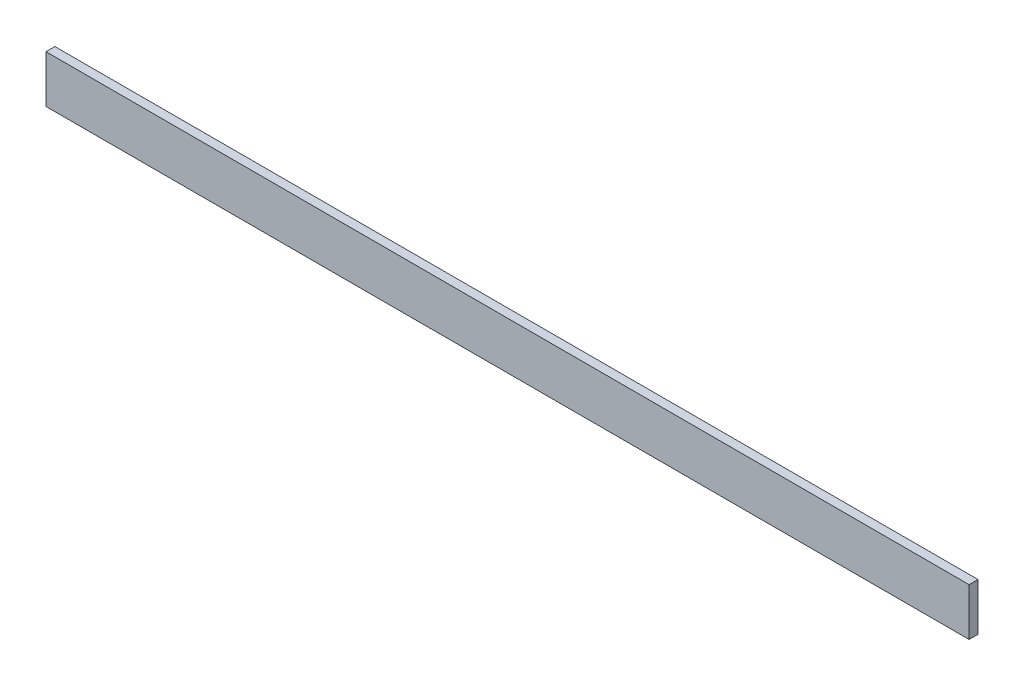
ISO-10303-21;
HEADER;
FILE_DESCRIPTION(('STEP AP214'),'2;1');
FILE_NAME('part.step','',(''),(''),'','','');
FILE_SCHEMA(('AUTOMOTIVE_DESIGN { 1 0 10303 214 1 1 1 1 }'));
ENDSEC;
DATA;
#1=APPLICATION_CONTEXT('core data for automotive mechanical design processes');
#2=APPLICATION_PROTOCOL_DEFINITION('international standard','automotive_design',2000,#1);
#3=PRODUCT_CONTEXT('',#1,'mechanical');
#4=PRODUCT('Part','Part','',(#3));
#5=PRODUCT_RELATED_PRODUCT_CATEGORY('part','',(#4));
#6=PRODUCT_DEFINITION_FORMATION('','',#4);
#7=PRODUCT_DEFINITION_CONTEXT('part definition',#1,'design');
#8=PRODUCT_DEFINITION('design','',#6,#7);
#9=PRODUCT_DEFINITION_SHAPE('','',#8);
#10=(LENGTH_UNIT() NAMED_UNIT(*) SI_UNIT(.MILLI.,.METRE.));
#11=(NAMED_UNIT(*) PLANE_ANGLE_UNIT() SI_UNIT($,.RADIAN.));
#12=(NAMED_UNIT(*) SI_UNIT($,.STERADIAN.) SOLID_ANGLE_UNIT());
#13=UNCERTAINTY_MEASURE_WITH_UNIT(LENGTH_MEASURE(1.E-05),#10,'distance_accuracy_value','');
#14=(GEOMETRIC_REPRESENTATION_CONTEXT(3) GLOBAL_UNCERTAINTY_ASSIGNED_CONTEXT((#13)) GLOBAL_UNIT_ASSIGNED_CONTEXT((#10,
#11,#12)) REPRESENTATION_CONTEXT('',''));
#15=CARTESIAN_POINT('',(0.,0.,0.));
#16=DIRECTION('',(0.,0.,1.));
#17=DIRECTION('',(1.,0.,0.));
#18=AXIS2_PLACEMENT_3D('',#15,#16,#17);
#19=CARTESIAN_POINT('',(0.,0.,9.525));
#20=DIRECTION('',(1.,0.,0.));
#21=DIRECTION('',(0.,0.,-1.));
#22=AXIS2_PLACEMENT_3D('',#19,#20,#21);
#23=PLANE('',#22);
#24=DIRECTION('',(0.,-1.,0.));
#25=VECTOR('',#24,1.);
#26=CARTESIAN_POINT('',(0.,0.,0.));
#27=LINE('',#26,#25);
#28=CARTESIAN_POINT('',(0.,50.8,0.));
#29=VERTEX_POINT('',#28);
#30=CARTESIAN_POINT('',(0.,0.,0.));
#31=VERTEX_POINT('',#30);
#32=EDGE_CURVE('E100',#29,#31,#27,.T.);
#33=ORIENTED_EDGE('',*,*,#32,.T.);
#34=DIRECTION('',(0.,0.,-1.));
#35=VECTOR('',#34,1.);
#36=CARTESIAN_POINT('',(0.,0.,9.525));
#37=LINE('',#36,#35);
#38=CARTESIAN_POINT('',(0.,0.,9.525));
#39=VERTEX_POINT('',#38);
#40=EDGE_CURVE('E11',#39,#31,#37,.T.);
#41=ORIENTED_EDGE('',*,*,#40,.F.);
#42=DIRECTION('',(0.,-1.,0.));
#43=VECTOR('',#42,1.);
#44=CARTESIAN_POINT('',(0.,0.,9.525));
#45=LINE('',#44,#43);
#46=CARTESIAN_POINT('',(0.,50.8,9.525));
#47=VERTEX_POINT('',#46);
#48=EDGE_CURVE('E88',#47,#39,#45,.T.);
#49=ORIENTED_EDGE('',*,*,#48,.F.);
#50=DIRECTION('',(0.,0.,-1.));
#51=VECTOR('',#50,1.);
#52=CARTESIAN_POINT('',(0.,50.8,9.525));
#53=LINE('',#52,#51);
#54=EDGE_CURVE('E96',#47,#29,#53,.T.);
#55=ORIENTED_EDGE('',*,*,#54,.T.);
#56=EDGE_LOOP('',(#33,#41,#49,#55));
#57=FACE_BOUND('',#56,.T.);
#58=ADVANCED_FACE('F37',(#57),#23,.F.);
#59=CARTESIAN_POINT('',(0.,0.,9.525));
#60=DIRECTION('',(0.,1.,0.));
#61=DIRECTION('',(0.,0.,1.));
#62=AXIS2_PLACEMENT_3D('',#59,#60,#61);
#63=PLANE('',#62);
#64=DIRECTION('',(1.,0.,0.));
#65=VECTOR('',#64,1.);
#66=CARTESIAN_POINT('',(0.,0.,0.));
#67=LINE('',#66,#65);
#68=CARTESIAN_POINT('',(987.6,0.,0.));
#69=VERTEX_POINT('',#68);
#70=EDGE_CURVE('E92',#31,#69,#67,.T.);
#71=ORIENTED_EDGE('',*,*,#70,.T.);
#72=DIRECTION('',(0.,0.,-1.));
#73=VECTOR('',#72,1.);
#74=CARTESIAN_POINT('',(987.6,0.,9.525));
#75=LINE('',#74,#73);
#76=CARTESIAN_POINT('',(987.6,0.,9.525));
#77=VERTEX_POINT('',#76);
#78=EDGE_CURVE('E45',#77,#69,#75,.T.);
#79=ORIENTED_EDGE('',*,*,#78,.F.);
#80=DIRECTION('',(1.,0.,0.));
#81=VECTOR('',#80,1.);
#82=CARTESIAN_POINT('',(0.,0.,9.525));
#83=LINE('',#82,#81);
#84=EDGE_CURVE('E83',#39,#77,#83,.T.);
#85=ORIENTED_EDGE('',*,*,#84,.F.);
#86=ORIENTED_EDGE('',*,*,#40,.T.);
#87=EDGE_LOOP('',(#71,#79,#85,#86));
#88=FACE_BOUND('',#87,.T.);
#89=ADVANCED_FACE('F91',(#88),#63,.F.);
#90=CARTESIAN_POINT('',(987.6,0.,9.525));
#91=DIRECTION('',(-1.,0.,0.));
#92=DIRECTION('',(0.,0.,1.));
#93=AXIS2_PLACEMENT_3D('',#90,#91,#92);
#94=PLANE('',#93);
#95=DIRECTION('',(0.,1.,0.));
#96=VECTOR('',#95,1.);
#97=CARTESIAN_POINT('',(987.6,0.,0.));
#98=LINE('',#97,#96);
#99=CARTESIAN_POINT('',(987.6,50.8,0.));
#100=VERTEX_POINT('',#99);
#101=EDGE_CURVE('E70',#69,#100,#98,.T.);
#102=ORIENTED_EDGE('',*,*,#101,.T.);
#103=DIRECTION('',(0.,0.,-1.));
#104=VECTOR('',#103,1.);
#105=CARTESIAN_POINT('',(987.6,50.8,9.525));
#106=LINE('',#105,#104);
#107=CARTESIAN_POINT('',(987.6,50.8,9.525));
#108=VERTEX_POINT('',#107);
#109=EDGE_CURVE('E93',#108,#100,#106,.T.);
#110=ORIENTED_EDGE('',*,*,#109,.F.);
#111=DIRECTION('',(0.,1.,0.));
#112=VECTOR('',#111,1.);
#113=CARTESIAN_POINT('',(987.6,0.,9.525));
#114=LINE('',#113,#112);
#115=EDGE_CURVE('E86',#77,#108,#114,.T.);
#116=ORIENTED_EDGE('',*,*,#115,.F.);
#117=ORIENTED_EDGE('',*,*,#78,.T.);
#118=EDGE_LOOP('',(#102,#110,#116,#117));
#119=FACE_BOUND('',#118,.T.);
#120=ADVANCED_FACE('F94',(#119),#94,.F.);
#121=CARTESIAN_POINT('',(0.,50.8,9.525));
#122=DIRECTION('',(0.,-1.,0.));
#123=DIRECTION('',(0.,0.,-1.));
#124=AXIS2_PLACEMENT_3D('',#121,#122,#123);
#125=PLANE('',#124);
#126=DIRECTION('',(-1.,0.,0.));
#127=VECTOR('',#126,1.);
#128=CARTESIAN_POINT('',(0.,50.8,0.));
#129=LINE('',#128,#127);
#130=EDGE_CURVE('E76',#100,#29,#129,.T.);
#131=ORIENTED_EDGE('',*,*,#130,.T.);
#132=ORIENTED_EDGE('',*,*,#54,.F.);
#133=DIRECTION('',(-1.,0.,0.));
#134=VECTOR('',#133,1.);
#135=CARTESIAN_POINT('',(0.,50.8,9.525));
#136=LINE('',#135,#134);
#137=EDGE_CURVE('E53',#108,#47,#136,.T.);
#138=ORIENTED_EDGE('',*,*,#137,.F.);
#139=ORIENTED_EDGE('',*,*,#109,.T.);
#140=EDGE_LOOP('',(#131,#132,#138,#139));
#141=FACE_BOUND('',#140,.T.);
#142=ADVANCED_FACE('F107',(#141),#125,.F.);
#143=CARTESIAN_POINT('',(0.,0.,9.525));
#144=DIRECTION('',(0.,0.,-1.));
#145=DIRECTION('',(-1.,0.,0.));
#146=AXIS2_PLACEMENT_3D('',#143,#144,#145);
#147=PLANE('',#146);
#148=ORIENTED_EDGE('',*,*,#48,.T.);
#149=ORIENTED_EDGE('',*,*,#84,.T.);
#150=ORIENTED_EDGE('',*,*,#115,.T.);
#151=ORIENTED_EDGE('',*,*,#137,.T.);
#152=EDGE_LOOP('',(#148,#149,#150,#151));
#153=FACE_BOUND('',#152,.T.);
#154=ADVANCED_FACE('F84',(#153),#147,.F.);
#155=CARTESIAN_POINT('',(0.,0.,0.));
#156=DIRECTION('',(0.,0.,-1.));
#157=DIRECTION('',(-1.,0.,0.));
#158=AXIS2_PLACEMENT_3D('',#155,#156,#157);
#159=PLANE('',#158);
#160=ORIENTED_EDGE('',*,*,#32,.F.);
#161=ORIENTED_EDGE('',*,*,#130,.F.);
#162=ORIENTED_EDGE('',*,*,#101,.F.);
#163=ORIENTED_EDGE('',*,*,#70,.F.);
#164=EDGE_LOOP('',(#160,#161,#162,#163));
#165=FACE_BOUND('',#164,.T.);
#166=ADVANCED_FACE('F110',(#165),#159,.T.);
#167=CLOSED_SHELL('',(#58,#89,#120,#142,#154,#166));
#168=MANIFOLD_SOLID_BREP('B2',#167);
#169=ADVANCED_BREP_SHAPE_REPRESENTATION('',(#18,#168),#14);
#170=SHAPE_DEFINITION_REPRESENTATION(#9,#169);
ENDSEC;
END-ISO-10303-21;
